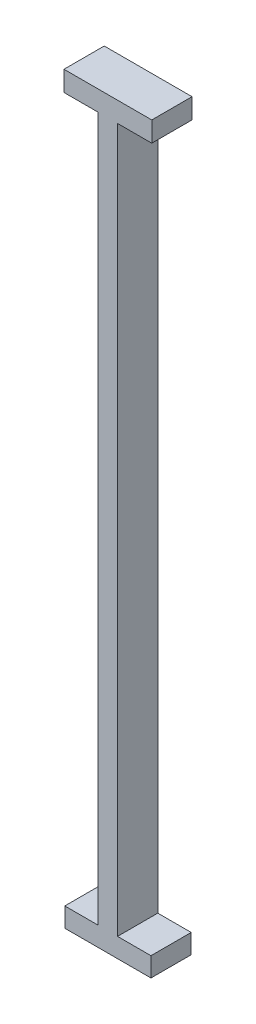
ISO-10303-21;
HEADER;
FILE_DESCRIPTION(('STEP AP214'),'2;1');
FILE_NAME('part.step','',(''),(''),'','','');
FILE_SCHEMA(('AUTOMOTIVE_DESIGN { 1 0 10303 214 1 1 1 1 }'));
ENDSEC;
DATA;
#1=APPLICATION_CONTEXT('core data for automotive mechanical design processes');
#2=APPLICATION_PROTOCOL_DEFINITION('international standard','automotive_design',2000,#1);
#3=PRODUCT_CONTEXT('',#1,'mechanical');
#4=PRODUCT('Part','Part','',(#3));
#5=PRODUCT_RELATED_PRODUCT_CATEGORY('part','',(#4));
#6=PRODUCT_DEFINITION_FORMATION('','',#4);
#7=PRODUCT_DEFINITION_CONTEXT('part definition',#1,'design');
#8=PRODUCT_DEFINITION('design','',#6,#7);
#9=PRODUCT_DEFINITION_SHAPE('','',#8);
#10=(LENGTH_UNIT() NAMED_UNIT(*) SI_UNIT(.MILLI.,.METRE.));
#11=(NAMED_UNIT(*) PLANE_ANGLE_UNIT() SI_UNIT($,.RADIAN.));
#12=(NAMED_UNIT(*) SI_UNIT($,.STERADIAN.) SOLID_ANGLE_UNIT());
#13=UNCERTAINTY_MEASURE_WITH_UNIT(LENGTH_MEASURE(1.E-05),#10,'distance_accuracy_value','');
#14=(GEOMETRIC_REPRESENTATION_CONTEXT(3) GLOBAL_UNCERTAINTY_ASSIGNED_CONTEXT((#13)) GLOBAL_UNIT_ASSIGNED_CONTEXT((#10,
#11,#12)) REPRESENTATION_CONTEXT('',''));
#15=CARTESIAN_POINT('',(0.,0.,0.));
#16=DIRECTION('',(0.,0.,1.));
#17=DIRECTION('',(1.,0.,0.));
#18=AXIS2_PLACEMENT_3D('',#15,#16,#17);
#19=CARTESIAN_POINT('',(-2.80891089108911,0.,10.));
#20=DIRECTION('',(1.,0.,0.));
#21=DIRECTION('',(0.,1.,0.));
#22=AXIS2_PLACEMENT_3D('',#19,#20,#21);
#23=PLANE('',#22);
#24=DIRECTION('',(0.,0.,1.));
#25=VECTOR('',#24,1.);
#26=CARTESIAN_POINT('',(-2.80891089108915,172.971577661438,0.));
#27=LINE('',#26,#25);
#28=CARTESIAN_POINT('',(-2.80891089108914,172.971577661438,0.));
#29=VERTEX_POINT('',#28);
#30=CARTESIAN_POINT('',(-2.80891089108915,172.971577661438,10.));
#31=VERTEX_POINT('',#30);
#32=EDGE_CURVE('E59',#29,#31,#27,.T.);
#33=ORIENTED_EDGE('',*,*,#32,.F.);
#34=DIRECTION('',(0.,-1.,0.));
#35=VECTOR('',#34,1.);
#36=CARTESIAN_POINT('',(-2.80891089108911,0.,0.));
#37=LINE('',#36,#35);
#38=CARTESIAN_POINT('',(-2.80891089108911,-1.87986798679868,0.));
#39=VERTEX_POINT('',#38);
#40=EDGE_CURVE('E152',#29,#39,#37,.T.);
#41=ORIENTED_EDGE('',*,*,#40,.T.);
#42=DIRECTION('',(0.,0.,-1.));
#43=VECTOR('',#42,1.);
#44=CARTESIAN_POINT('',(-2.80891089108911,-1.87986798679868,10.));
#45=LINE('',#44,#43);
#46=CARTESIAN_POINT('',(-2.80891089108911,-1.87986798679868,10.));
#47=VERTEX_POINT('',#46);
#48=EDGE_CURVE('E11',#47,#39,#45,.T.);
#49=ORIENTED_EDGE('',*,*,#48,.F.);
#50=DIRECTION('',(0.,-1.,0.));
#51=VECTOR('',#50,1.);
#52=CARTESIAN_POINT('',(-2.80891089108911,0.,10.));
#53=LINE('',#52,#51);
#54=EDGE_CURVE('E181',#31,#47,#53,.T.);
#55=ORIENTED_EDGE('',*,*,#54,.F.);
#56=EDGE_LOOP('',(#33,#41,#49,#55));
#57=FACE_BOUND('',#56,.T.);
#58=ADVANCED_FACE('F43',(#57),#23,.F.);
#59=CARTESIAN_POINT('',(1.99108910891089,0.,10.));
#60=DIRECTION('',(1.,0.,0.));
#61=DIRECTION('',(0.,1.,0.));
#62=AXIS2_PLACEMENT_3D('',#59,#60,#61);
#63=PLANE('',#62);
#64=DIRECTION('',(0.,0.,-1.));
#65=VECTOR('',#64,1.);
#66=CARTESIAN_POINT('',(1.99108910891085,172.971577661438,10.));
#67=LINE('',#66,#65);
#68=CARTESIAN_POINT('',(1.99108910891092,172.971577661438,10.));
#69=VERTEX_POINT('',#68);
#70=CARTESIAN_POINT('',(1.99108910891085,172.971577661438,0.));
#71=VERTEX_POINT('',#70);
#72=EDGE_CURVE('E68',#69,#71,#67,.T.);
#73=ORIENTED_EDGE('',*,*,#72,.F.);
#74=DIRECTION('',(0.,-1.,0.));
#75=VECTOR('',#74,1.);
#76=CARTESIAN_POINT('',(1.99108910891089,0.,10.));
#77=LINE('',#76,#75);
#78=CARTESIAN_POINT('',(1.99108910891089,-1.87986798679868,10.));
#79=VERTEX_POINT('',#78);
#80=EDGE_CURVE('E182',#69,#79,#77,.T.);
#81=ORIENTED_EDGE('',*,*,#80,.T.);
#82=DIRECTION('',(0.,0.,-1.));
#83=VECTOR('',#82,1.);
#84=CARTESIAN_POINT('',(1.99108910891089,-1.87986798679868,10.));
#85=LINE('',#84,#83);
#86=CARTESIAN_POINT('',(1.99108910891089,-1.87986798679868,0.));
#87=VERTEX_POINT('',#86);
#88=EDGE_CURVE('E207',#79,#87,#85,.T.);
#89=ORIENTED_EDGE('',*,*,#88,.T.);
#90=DIRECTION('',(0.,-1.,0.));
#91=VECTOR('',#90,1.);
#92=CARTESIAN_POINT('',(1.99108910891089,0.,0.));
#93=LINE('',#92,#91);
#94=EDGE_CURVE('E179',#71,#87,#93,.T.);
#95=ORIENTED_EDGE('',*,*,#94,.F.);
#96=EDGE_LOOP('',(#73,#81,#89,#95));
#97=FACE_BOUND('',#96,.T.);
#98=ADVANCED_FACE('F44',(#97),#63,.T.);
#99=CARTESIAN_POINT('',(0.,-1.87986798679868,10.));
#100=DIRECTION('',(0.,1.,0.));
#101=DIRECTION('',(0.,0.,1.));
#102=AXIS2_PLACEMENT_3D('',#99,#100,#101);
#103=PLANE('',#102);
#104=DIRECTION('',(1.,0.,0.));
#105=VECTOR('',#104,1.);
#106=CARTESIAN_POINT('',(0.,-1.87986798679868,0.));
#107=LINE('',#106,#105);
#108=CARTESIAN_POINT('',(-11.1089108910891,-1.87986798679868,0.));
#109=VERTEX_POINT('',#108);
#110=EDGE_CURVE('E200',#109,#39,#107,.T.);
#111=ORIENTED_EDGE('',*,*,#110,.F.);
#112=DIRECTION('',(0.,0.,-1.));
#113=VECTOR('',#112,1.);
#114=CARTESIAN_POINT('',(-11.1089108910891,-1.87986798679868,10.));
#115=LINE('',#114,#113);
#116=CARTESIAN_POINT('',(-11.1089108910891,-1.87986798679868,10.));
#117=VERTEX_POINT('',#116);
#118=EDGE_CURVE('E51',#117,#109,#115,.T.);
#119=ORIENTED_EDGE('',*,*,#118,.F.);
#120=DIRECTION('',(1.,0.,0.));
#121=VECTOR('',#120,1.);
#122=CARTESIAN_POINT('',(0.,-1.87986798679868,10.));
#123=LINE('',#122,#121);
#124=EDGE_CURVE('E187',#117,#47,#123,.T.);
#125=ORIENTED_EDGE('',*,*,#124,.T.);
#126=ORIENTED_EDGE('',*,*,#48,.T.);
#127=EDGE_LOOP('',(#111,#119,#125,#126));
#128=FACE_BOUND('',#127,.T.);
#129=ADVANCED_FACE('F230',(#128),#103,.T.);
#130=CARTESIAN_POINT('',(-11.1089108910891,0.,10.));
#131=DIRECTION('',(1.,0.,0.));
#132=DIRECTION('',(0.,1.,0.));
#133=AXIS2_PLACEMENT_3D('',#130,#131,#132);
#134=PLANE('',#133);
#135=DIRECTION('',(0.,-1.,0.));
#136=VECTOR('',#135,1.);
#137=CARTESIAN_POINT('',(-11.1089108910891,0.,0.));
#138=LINE('',#137,#136);
#139=CARTESIAN_POINT('',(-11.1089108910891,-6.67986798679868,0.));
#140=VERTEX_POINT('',#139);
#141=EDGE_CURVE('E203',#109,#140,#138,.T.);
#142=ORIENTED_EDGE('',*,*,#141,.T.);
#143=DIRECTION('',(0.,0.,-1.));
#144=VECTOR('',#143,1.);
#145=CARTESIAN_POINT('',(-11.1089108910891,-6.67986798679868,10.));
#146=LINE('',#145,#144);
#147=CARTESIAN_POINT('',(-11.1089108910891,-6.67986798679868,10.));
#148=VERTEX_POINT('',#147);
#149=EDGE_CURVE('E216',#148,#140,#146,.T.);
#150=ORIENTED_EDGE('',*,*,#149,.F.);
#151=DIRECTION('',(0.,-1.,0.));
#152=VECTOR('',#151,1.);
#153=CARTESIAN_POINT('',(-11.1089108910891,0.,10.));
#154=LINE('',#153,#152);
#155=EDGE_CURVE('E189',#117,#148,#154,.T.);
#156=ORIENTED_EDGE('',*,*,#155,.F.);
#157=ORIENTED_EDGE('',*,*,#118,.T.);
#158=EDGE_LOOP('',(#142,#150,#156,#157));
#159=FACE_BOUND('',#158,.T.);
#160=ADVANCED_FACE('F222',(#159),#134,.F.);
#161=CARTESIAN_POINT('',(0.,-6.67986798679868,10.));
#162=DIRECTION('',(0.,1.,0.));
#163=DIRECTION('',(0.,0.,1.));
#164=AXIS2_PLACEMENT_3D('',#161,#162,#163);
#165=PLANE('',#164);
#166=DIRECTION('',(1.,0.,0.));
#167=VECTOR('',#166,1.);
#168=CARTESIAN_POINT('',(0.,-6.67986798679868,0.));
#169=LINE('',#168,#167);
#170=CARTESIAN_POINT('',(10.2910891089109,-6.67986798679868,0.));
#171=VERTEX_POINT('',#170);
#172=EDGE_CURVE('E201',#140,#171,#169,.T.);
#173=ORIENTED_EDGE('',*,*,#172,.T.);
#174=DIRECTION('',(0.,0.,-1.));
#175=VECTOR('',#174,1.);
#176=CARTESIAN_POINT('',(10.2910891089109,-6.67986798679868,10.));
#177=LINE('',#176,#175);
#178=CARTESIAN_POINT('',(10.2910891089109,-6.67986798679868,10.));
#179=VERTEX_POINT('',#178);
#180=EDGE_CURVE('E212',#179,#171,#177,.T.);
#181=ORIENTED_EDGE('',*,*,#180,.F.);
#182=DIRECTION('',(1.,0.,0.));
#183=VECTOR('',#182,1.);
#184=CARTESIAN_POINT('',(0.,-6.67986798679868,10.));
#185=LINE('',#184,#183);
#186=EDGE_CURVE('E195',#148,#179,#185,.T.);
#187=ORIENTED_EDGE('',*,*,#186,.F.);
#188=ORIENTED_EDGE('',*,*,#149,.T.);
#189=EDGE_LOOP('',(#173,#181,#187,#188));
#190=FACE_BOUND('',#189,.T.);
#191=ADVANCED_FACE('F259',(#190),#165,.F.);
#192=CARTESIAN_POINT('',(10.2910891089109,0.,10.));
#193=DIRECTION('',(1.,0.,0.));
#194=DIRECTION('',(0.,0.,-1.));
#195=AXIS2_PLACEMENT_3D('',#192,#193,#194);
#196=PLANE('',#195);
#197=DIRECTION('',(0.,-1.,0.));
#198=VECTOR('',#197,1.);
#199=CARTESIAN_POINT('',(10.2910891089109,0.,0.));
#200=LINE('',#199,#198);
#201=CARTESIAN_POINT('',(10.2910891089109,-1.87986798679868,0.));
#202=VERTEX_POINT('',#201);
#203=EDGE_CURVE('E206',#202,#171,#200,.T.);
#204=ORIENTED_EDGE('',*,*,#203,.F.);
#205=DIRECTION('',(0.,0.,-1.));
#206=VECTOR('',#205,1.);
#207=CARTESIAN_POINT('',(10.2910891089109,-1.87986798679868,10.));
#208=LINE('',#207,#206);
#209=CARTESIAN_POINT('',(10.2910891089109,-1.87986798679868,10.));
#210=VERTEX_POINT('',#209);
#211=EDGE_CURVE('E215',#210,#202,#208,.T.);
#212=ORIENTED_EDGE('',*,*,#211,.F.);
#213=DIRECTION('',(0.,-1.,0.));
#214=VECTOR('',#213,1.);
#215=CARTESIAN_POINT('',(10.2910891089109,0.,10.));
#216=LINE('',#215,#214);
#217=EDGE_CURVE('E192',#210,#179,#216,.T.);
#218=ORIENTED_EDGE('',*,*,#217,.T.);
#219=ORIENTED_EDGE('',*,*,#180,.T.);
#220=EDGE_LOOP('',(#204,#212,#218,#219));
#221=FACE_BOUND('',#220,.T.);
#222=ADVANCED_FACE('F254',(#221),#196,.T.);
#223=EDGE_CURVE('E184',#87,#202,#107,.T.);
#224=ORIENTED_EDGE('',*,*,#223,.F.);
#225=ORIENTED_EDGE('',*,*,#88,.F.);
#226=EDGE_CURVE('E186',#79,#210,#123,.T.);
#227=ORIENTED_EDGE('',*,*,#226,.T.);
#228=ORIENTED_EDGE('',*,*,#211,.T.);
#229=EDGE_LOOP('',(#224,#225,#227,#228));
#230=FACE_BOUND('',#229,.T.);
#231=ADVANCED_FACE('F253',(#230),#103,.T.);
#232=CARTESIAN_POINT('',(0.,0.,10.));
#233=DIRECTION('',(0.,0.,1.));
#234=DIRECTION('',(1.,0.,0.));
#235=AXIS2_PLACEMENT_3D('',#232,#233,#234);
#236=PLANE('',#235);
#237=ORIENTED_EDGE('',*,*,#80,.F.);
#238=DIRECTION('',(-1.,0.,0.));
#239=VECTOR('',#238,1.);
#240=CARTESIAN_POINT('',(10.4910891089109,172.971577661438,10.));
#241=LINE('',#240,#239);
#242=CARTESIAN_POINT('',(10.4910891089109,172.971577661438,10.));
#243=VERTEX_POINT('',#242);
#244=EDGE_CURVE('E166',#243,#69,#241,.T.);
#245=ORIENTED_EDGE('',*,*,#244,.F.);
#246=DIRECTION('',(0.,-1.,0.));
#247=VECTOR('',#246,1.);
#248=CARTESIAN_POINT('',(10.4910891089109,177.971577661438,10.));
#249=LINE('',#248,#247);
#250=CARTESIAN_POINT('',(10.4910891089109,177.971577661438,10.));
#251=VERTEX_POINT('',#250);
#252=EDGE_CURVE('E169',#251,#243,#249,.T.);
#253=ORIENTED_EDGE('',*,*,#252,.F.);
#254=DIRECTION('',(1.,0.,0.));
#255=VECTOR('',#254,1.);
#256=CARTESIAN_POINT('',(-2.80891089108911,177.971577661438,10.));
#257=LINE('',#256,#255);
#258=CARTESIAN_POINT('',(-11.3089108910891,177.971577661438,10.));
#259=VERTEX_POINT('',#258);
#260=EDGE_CURVE('E178',#259,#251,#257,.T.);
#261=ORIENTED_EDGE('',*,*,#260,.F.);
#262=DIRECTION('',(0.,1.,0.));
#263=VECTOR('',#262,1.);
#264=CARTESIAN_POINT('',(-11.3089108910891,177.971577661438,10.));
#265=LINE('',#264,#263);
#266=CARTESIAN_POINT('',(-11.3089108910891,172.971577661438,10.));
#267=VERTEX_POINT('',#266);
#268=EDGE_CURVE('E142',#267,#259,#265,.T.);
#269=ORIENTED_EDGE('',*,*,#268,.F.);
#270=DIRECTION('',(1.,0.,0.));
#271=VECTOR('',#270,1.);
#272=CARTESIAN_POINT('',(-11.3089108910891,172.971577661438,10.));
#273=LINE('',#272,#271);
#274=EDGE_CURVE('E136',#267,#31,#273,.T.);
#275=ORIENTED_EDGE('',*,*,#274,.T.);
#276=ORIENTED_EDGE('',*,*,#54,.T.);
#277=ORIENTED_EDGE('',*,*,#124,.F.);
#278=ORIENTED_EDGE('',*,*,#155,.T.);
#279=ORIENTED_EDGE('',*,*,#186,.T.);
#280=ORIENTED_EDGE('',*,*,#217,.F.);
#281=ORIENTED_EDGE('',*,*,#226,.F.);
#282=EDGE_LOOP('',(#237,#245,#253,#261,#269,#275,#276,#277,#278,#279,#280,#281));
#283=FACE_BOUND('',#282,.T.);
#284=ADVANCED_FACE('F226',(#283),#236,.T.);
#285=CARTESIAN_POINT('',(0.,0.,0.));
#286=DIRECTION('',(0.,0.,1.));
#287=DIRECTION('',(1.,0.,0.));
#288=AXIS2_PLACEMENT_3D('',#285,#286,#287);
#289=PLANE('',#288);
#290=DIRECTION('',(-1.,0.,0.));
#291=VECTOR('',#290,1.);
#292=CARTESIAN_POINT('',(-2.80891089108911,177.971577661438,0.));
#293=LINE('',#292,#291);
#294=CARTESIAN_POINT('',(10.4910891089109,177.971577661438,0.));
#295=VERTEX_POINT('',#294);
#296=CARTESIAN_POINT('',(-11.3089108910891,177.971577661438,0.));
#297=VERTEX_POINT('',#296);
#298=EDGE_CURVE('E176',#295,#297,#293,.T.);
#299=ORIENTED_EDGE('',*,*,#298,.F.);
#300=DIRECTION('',(0.,-1.,0.));
#301=VECTOR('',#300,1.);
#302=CARTESIAN_POINT('',(10.4910891089109,177.971577661438,0.));
#303=LINE('',#302,#301);
#304=CARTESIAN_POINT('',(10.4910891089109,172.971577661438,0.));
#305=VERTEX_POINT('',#304);
#306=EDGE_CURVE('E165',#295,#305,#303,.T.);
#307=ORIENTED_EDGE('',*,*,#306,.T.);
#308=DIRECTION('',(-1.,0.,0.));
#309=VECTOR('',#308,1.);
#310=CARTESIAN_POINT('',(10.4910891089109,172.971577661438,0.));
#311=LINE('',#310,#309);
#312=EDGE_CURVE('E173',#305,#71,#311,.T.);
#313=ORIENTED_EDGE('',*,*,#312,.T.);
#314=ORIENTED_EDGE('',*,*,#94,.T.);
#315=ORIENTED_EDGE('',*,*,#223,.T.);
#316=ORIENTED_EDGE('',*,*,#203,.T.);
#317=ORIENTED_EDGE('',*,*,#172,.F.);
#318=ORIENTED_EDGE('',*,*,#141,.F.);
#319=ORIENTED_EDGE('',*,*,#110,.T.);
#320=ORIENTED_EDGE('',*,*,#40,.F.);
#321=DIRECTION('',(1.,0.,0.));
#322=VECTOR('',#321,1.);
#323=CARTESIAN_POINT('',(-11.3089108910891,172.971577661438,0.));
#324=LINE('',#323,#322);
#325=CARTESIAN_POINT('',(-11.3089108910891,172.971577661438,0.));
#326=VERTEX_POINT('',#325);
#327=EDGE_CURVE('E138',#326,#29,#324,.T.);
#328=ORIENTED_EDGE('',*,*,#327,.F.);
#329=DIRECTION('',(0.,-1.,0.));
#330=VECTOR('',#329,1.);
#331=CARTESIAN_POINT('',(-11.3089108910891,177.971577661438,0.));
#332=LINE('',#331,#330);
#333=EDGE_CURVE('E141',#297,#326,#332,.T.);
#334=ORIENTED_EDGE('',*,*,#333,.F.);
#335=EDGE_LOOP('',(#299,#307,#313,#314,#315,#316,#317,#318,#319,#320,#328,#334));
#336=FACE_BOUND('',#335,.T.);
#337=ADVANCED_FACE('F155',(#336),#289,.F.);
#338=CARTESIAN_POINT('',(0.,177.971577661438,0.));
#339=DIRECTION('',(0.,1.,0.));
#340=DIRECTION('',(0.,0.,1.));
#341=AXIS2_PLACEMENT_3D('',#338,#339,#340);
#342=PLANE('',#341);
#343=ORIENTED_EDGE('',*,*,#298,.T.);
#344=DIRECTION('',(0.,0.,-1.));
#345=VECTOR('',#344,1.);
#346=CARTESIAN_POINT('',(-11.3089108910891,177.971577661438,0.));
#347=LINE('',#346,#345);
#348=EDGE_CURVE('E149',#259,#297,#347,.T.);
#349=ORIENTED_EDGE('',*,*,#348,.F.);
#350=ORIENTED_EDGE('',*,*,#260,.T.);
#351=DIRECTION('',(0.,0.,-1.));
#352=VECTOR('',#351,1.);
#353=CARTESIAN_POINT('',(10.4910891089109,177.971577661438,10.));
#354=LINE('',#353,#352);
#355=EDGE_CURVE('E164',#251,#295,#354,.T.);
#356=ORIENTED_EDGE('',*,*,#355,.T.);
#357=EDGE_LOOP('',(#343,#349,#350,#356));
#358=FACE_BOUND('',#357,.T.);
#359=ADVANCED_FACE('F234',(#358),#342,.T.);
#360=CARTESIAN_POINT('',(10.4910891089109,172.971577661438,10.));
#361=DIRECTION('',(0.,1.,0.));
#362=DIRECTION('',(-1.,0.,0.));
#363=AXIS2_PLACEMENT_3D('',#360,#361,#362);
#364=PLANE('',#363);
#365=ORIENTED_EDGE('',*,*,#72,.T.);
#366=ORIENTED_EDGE('',*,*,#312,.F.);
#367=DIRECTION('',(0.,0.,-1.));
#368=VECTOR('',#367,1.);
#369=CARTESIAN_POINT('',(10.4910891089109,172.971577661438,10.));
#370=LINE('',#369,#368);
#371=EDGE_CURVE('E156',#243,#305,#370,.T.);
#372=ORIENTED_EDGE('',*,*,#371,.F.);
#373=ORIENTED_EDGE('',*,*,#244,.T.);
#374=EDGE_LOOP('',(#365,#366,#372,#373));
#375=FACE_BOUND('',#374,.T.);
#376=ADVANCED_FACE('F244',(#375),#364,.F.);
#377=CARTESIAN_POINT('',(10.4910891089109,0.,0.));
#378=DIRECTION('',(-1.,0.,0.));
#379=DIRECTION('',(0.,-1.,0.));
#380=AXIS2_PLACEMENT_3D('',#377,#378,#379);
#381=PLANE('',#380);
#382=ORIENTED_EDGE('',*,*,#371,.T.);
#383=ORIENTED_EDGE('',*,*,#306,.F.);
#384=ORIENTED_EDGE('',*,*,#355,.F.);
#385=ORIENTED_EDGE('',*,*,#252,.T.);
#386=EDGE_LOOP('',(#382,#383,#384,#385));
#387=FACE_BOUND('',#386,.T.);
#388=ADVANCED_FACE('F239',(#387),#381,.F.);
#389=CARTESIAN_POINT('',(-11.3089108910891,172.971577661438,0.));
#390=DIRECTION('',(0.,1.,0.));
#391=DIRECTION('',(-1.,0.,0.));
#392=AXIS2_PLACEMENT_3D('',#389,#390,#391);
#393=PLANE('',#392);
#394=ORIENTED_EDGE('',*,*,#32,.T.);
#395=ORIENTED_EDGE('',*,*,#274,.F.);
#396=DIRECTION('',(0.,0.,1.));
#397=VECTOR('',#396,1.);
#398=CARTESIAN_POINT('',(-11.3089108910891,172.971577661438,0.));
#399=LINE('',#398,#397);
#400=EDGE_CURVE('E135',#326,#267,#399,.T.);
#401=ORIENTED_EDGE('',*,*,#400,.F.);
#402=ORIENTED_EDGE('',*,*,#327,.T.);
#403=EDGE_LOOP('',(#394,#395,#401,#402));
#404=FACE_BOUND('',#403,.T.);
#405=ADVANCED_FACE('F134',(#404),#393,.F.);
#406=CARTESIAN_POINT('',(-11.3089108910891,0.,0.));
#407=DIRECTION('',(-1.,0.,0.));
#408=DIRECTION('',(0.,-1.,0.));
#409=AXIS2_PLACEMENT_3D('',#406,#407,#408);
#410=PLANE('',#409);
#411=ORIENTED_EDGE('',*,*,#333,.T.);
#412=ORIENTED_EDGE('',*,*,#400,.T.);
#413=ORIENTED_EDGE('',*,*,#268,.T.);
#414=ORIENTED_EDGE('',*,*,#348,.T.);
#415=EDGE_LOOP('',(#411,#412,#413,#414));
#416=FACE_BOUND('',#415,.T.);
#417=ADVANCED_FACE('F150',(#416),#410,.T.);
#418=CLOSED_SHELL('',(#58,#98,#129,#160,#191,#222,#231,#284,#337,#359,#376,#388,#405,#417));
#419=MANIFOLD_SOLID_BREP('B2',#418);
#420=ADVANCED_BREP_SHAPE_REPRESENTATION('',(#18,#419),#14);
#421=SHAPE_DEFINITION_REPRESENTATION(#9,#420);
ENDSEC;
END-ISO-10303-21;
